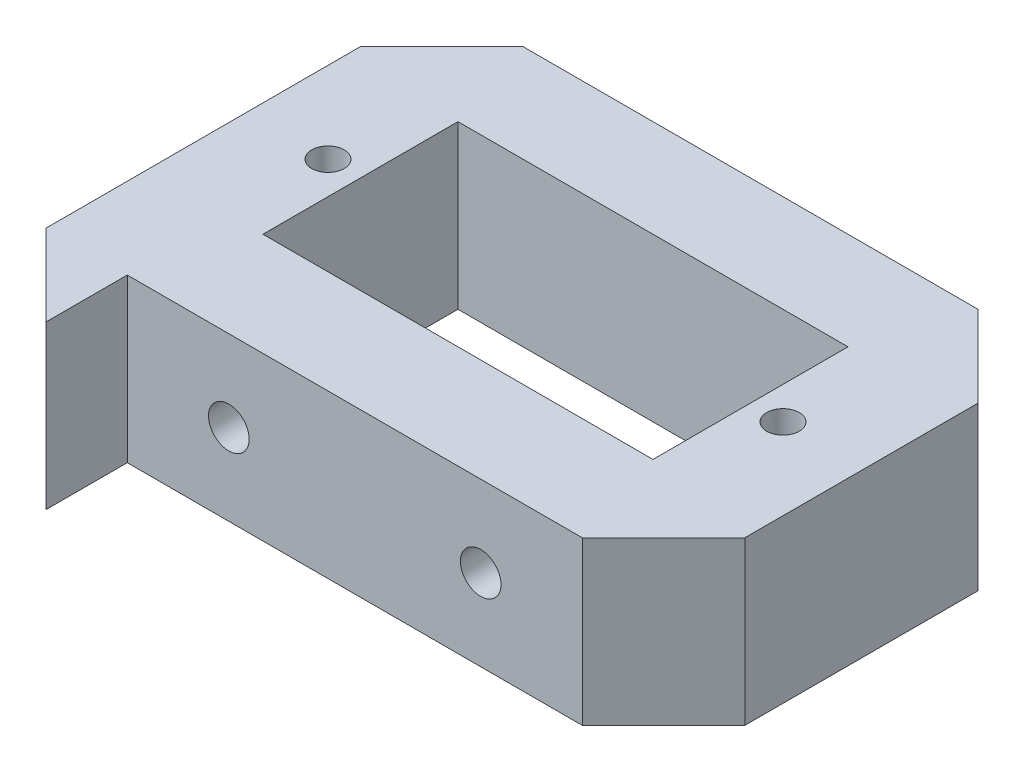
ISO-10303-21;
HEADER;
FILE_DESCRIPTION(('STEP AP214'),'2;1');
FILE_NAME('part.step','',(''),(''),'','','');
FILE_SCHEMA(('AUTOMOTIVE_DESIGN { 1 0 10303 214 1 1 1 1 }'));
ENDSEC;
DATA;
#1=APPLICATION_CONTEXT('core data for automotive mechanical design processes');
#2=APPLICATION_PROTOCOL_DEFINITION('international standard','automotive_design',2000,#1);
#3=PRODUCT_CONTEXT('',#1,'mechanical');
#4=PRODUCT('Part','Part','',(#3));
#5=PRODUCT_RELATED_PRODUCT_CATEGORY('part','',(#4));
#6=PRODUCT_DEFINITION_FORMATION('','',#4);
#7=PRODUCT_DEFINITION_CONTEXT('part definition',#1,'design');
#8=PRODUCT_DEFINITION('design','',#6,#7);
#9=PRODUCT_DEFINITION_SHAPE('','',#8);
#10=(LENGTH_UNIT() NAMED_UNIT(*) SI_UNIT(.MILLI.,.METRE.));
#11=(NAMED_UNIT(*) PLANE_ANGLE_UNIT() SI_UNIT($,.RADIAN.));
#12=(NAMED_UNIT(*) SI_UNIT($,.STERADIAN.) SOLID_ANGLE_UNIT());
#13=UNCERTAINTY_MEASURE_WITH_UNIT(LENGTH_MEASURE(1.E-05),#10,'distance_accuracy_value','');
#14=(GEOMETRIC_REPRESENTATION_CONTEXT(3) GLOBAL_UNCERTAINTY_ASSIGNED_CONTEXT((#13)) GLOBAL_UNIT_ASSIGNED_CONTEXT((#10,
#11,#12)) REPRESENTATION_CONTEXT('',''));
#15=CARTESIAN_POINT('',(0.,0.,0.));
#16=DIRECTION('',(0.,0.,1.));
#17=DIRECTION('',(1.,0.,0.));
#18=AXIS2_PLACEMENT_3D('',#15,#16,#17);
#19=CARTESIAN_POINT('',(12.0377358490566,10.,0.));
#20=DIRECTION('',(-1.,0.,0.));
#21=DIRECTION('',(0.,0.,1.));
#22=AXIS2_PLACEMENT_3D('',#19,#20,#21);
#23=PLANE('',#22);
#24=DIRECTION('',(0.,0.,-1.));
#25=VECTOR('',#24,1.);
#26=CARTESIAN_POINT('',(12.0377358490566,0.,0.));
#27=LINE('',#26,#25);
#28=CARTESIAN_POINT('',(12.0377358490566,0.,1.20754716981131));
#29=VERTEX_POINT('',#28);
#30=CARTESIAN_POINT('',(12.0377358490566,0.,-10.7924528301887));
#31=VERTEX_POINT('',#30);
#32=EDGE_CURVE('E198',#29,#31,#27,.T.);
#33=ORIENTED_EDGE('',*,*,#32,.F.);
#34=DIRECTION('',(0.,-1.,0.));
#35=VECTOR('',#34,1.);
#36=CARTESIAN_POINT('',(12.0377358490566,10.,1.20754716981131));
#37=LINE('',#36,#35);
#38=CARTESIAN_POINT('',(12.0377358490566,10.,1.20754716981131));
#39=VERTEX_POINT('',#38);
#40=EDGE_CURVE('E179',#39,#29,#37,.T.);
#41=ORIENTED_EDGE('',*,*,#40,.F.);
#42=DIRECTION('',(0.,0.,-1.));
#43=VECTOR('',#42,1.);
#44=CARTESIAN_POINT('',(12.0377358490566,10.,0.));
#45=LINE('',#44,#43);
#46=CARTESIAN_POINT('',(12.0377358490566,10.,-10.7924528301887));
#47=VERTEX_POINT('',#46);
#48=EDGE_CURVE('E223',#39,#47,#45,.T.);
#49=ORIENTED_EDGE('',*,*,#48,.T.);
#50=DIRECTION('',(0.,-1.,0.));
#51=VECTOR('',#50,1.);
#52=CARTESIAN_POINT('',(12.0377358490566,10.,-10.7924528301887));
#53=LINE('',#52,#51);
#54=EDGE_CURVE('E185',#47,#31,#53,.T.);
#55=ORIENTED_EDGE('',*,*,#54,.T.);
#56=EDGE_LOOP('',(#33,#41,#49,#55));
#57=FACE_BOUND('',#56,.T.);
#58=ADVANCED_FACE('F37',(#57),#23,.T.);
#59=CARTESIAN_POINT('',(0.,10.,1.20754716981131));
#60=DIRECTION('',(0.,0.,1.));
#61=DIRECTION('',(1.,0.,0.));
#62=AXIS2_PLACEMENT_3D('',#59,#60,#61);
#63=PLANE('',#62);
#64=CARTESIAN_POINT('',(7.78773584905659,5.,1.20754716981131));
#65=DIRECTION('',(0.,0.,1.));
#66=DIRECTION('',(1.,0.,0.));
#67=AXIS2_PLACEMENT_3D('',#64,#65,#66);
#68=CIRCLE('',#67,1.25);
#69=CARTESIAN_POINT('',(9.03773584905659,5.,1.20754716981131));
#70=VERTEX_POINT('',#69);
#71=EDGE_CURVE('E247',#70,#70,#68,.T.);
#72=ORIENTED_EDGE('',*,*,#71,.T.);
#73=EDGE_LOOP('',(#72));
#74=FACE_BOUND('',#73,.T.);
#75=CARTESIAN_POINT('',(-7.71226415094339,5.,1.20754716981131));
#76=DIRECTION('',(0.,0.,1.));
#77=DIRECTION('',(1.,0.,0.));
#78=AXIS2_PLACEMENT_3D('',#75,#76,#77);
#79=CIRCLE('',#78,1.25);
#80=CARTESIAN_POINT('',(-6.46226415094339,5.,1.20754716981131));
#81=VERTEX_POINT('',#80);
#82=EDGE_CURVE('E216',#81,#81,#79,.T.);
#83=ORIENTED_EDGE('',*,*,#82,.T.);
#84=EDGE_LOOP('',(#83));
#85=FACE_BOUND('',#84,.T.);
#86=DIRECTION('',(-1.,0.,0.));
#87=VECTOR('',#86,1.);
#88=CARTESIAN_POINT('',(0.,0.,1.20754716981131));
#89=LINE('',#88,#87);
#90=CARTESIAN_POINT('',(-11.9622641509434,0.,1.20754716981131));
#91=VERTEX_POINT('',#90);
#92=EDGE_CURVE('E195',#29,#91,#89,.T.);
#93=ORIENTED_EDGE('',*,*,#92,.T.);
#94=DIRECTION('',(0.,-1.,0.));
#95=VECTOR('',#94,1.);
#96=CARTESIAN_POINT('',(-11.9622641509434,10.,1.20754716981131));
#97=LINE('',#96,#95);
#98=CARTESIAN_POINT('',(-11.9622641509434,10.,1.20754716981131));
#99=VERTEX_POINT('',#98);
#100=EDGE_CURVE('E181',#99,#91,#97,.T.);
#101=ORIENTED_EDGE('',*,*,#100,.F.);
#102=DIRECTION('',(-1.,0.,0.));
#103=VECTOR('',#102,1.);
#104=CARTESIAN_POINT('',(0.,10.,1.20754716981131));
#105=LINE('',#104,#103);
#106=EDGE_CURVE('E221',#39,#99,#105,.T.);
#107=ORIENTED_EDGE('',*,*,#106,.F.);
#108=ORIENTED_EDGE('',*,*,#40,.T.);
#109=EDGE_LOOP('',(#93,#101,#107,#108));
#110=FACE_BOUND('',#109,.T.);
#111=ADVANCED_FACE('F294',(#74,#85,#110),#63,.F.);
#112=CARTESIAN_POINT('',(-11.9622641509434,10.,0.));
#113=DIRECTION('',(1.,0.,0.));
#114=DIRECTION('',(0.,0.,-1.));
#115=AXIS2_PLACEMENT_3D('',#112,#113,#114);
#116=PLANE('',#115);
#117=DIRECTION('',(0.,0.,1.));
#118=VECTOR('',#117,1.);
#119=CARTESIAN_POINT('',(-11.9622641509434,0.,0.));
#120=LINE('',#119,#118);
#121=CARTESIAN_POINT('',(-11.9622641509434,0.,-10.7924528301887));
#122=VERTEX_POINT('',#121);
#123=EDGE_CURVE('E192',#122,#91,#120,.T.);
#124=ORIENTED_EDGE('',*,*,#123,.F.);
#125=DIRECTION('',(0.,-1.,0.));
#126=VECTOR('',#125,1.);
#127=CARTESIAN_POINT('',(-11.9622641509434,10.,-10.7924528301887));
#128=LINE('',#127,#126);
#129=CARTESIAN_POINT('',(-11.9622641509434,10.,-10.7924528301887));
#130=VERTEX_POINT('',#129);
#131=EDGE_CURVE('E183',#130,#122,#128,.T.);
#132=ORIENTED_EDGE('',*,*,#131,.F.);
#133=DIRECTION('',(0.,0.,1.));
#134=VECTOR('',#133,1.);
#135=CARTESIAN_POINT('',(-11.9622641509434,10.,0.));
#136=LINE('',#135,#134);
#137=EDGE_CURVE('E218',#130,#99,#136,.T.);
#138=ORIENTED_EDGE('',*,*,#137,.T.);
#139=ORIENTED_EDGE('',*,*,#100,.T.);
#140=EDGE_LOOP('',(#124,#132,#138,#139));
#141=FACE_BOUND('',#140,.T.);
#142=ADVANCED_FACE('F300',(#141),#116,.T.);
#143=CARTESIAN_POINT('',(19.0377358490566,10.,0.));
#144=DIRECTION('',(1.,0.,0.));
#145=DIRECTION('',(0.,0.,-1.));
#146=AXIS2_PLACEMENT_3D('',#143,#144,#145);
#147=PLANE('',#146);
#148=DIRECTION('',(0.,0.,1.));
#149=VECTOR('',#148,1.);
#150=CARTESIAN_POINT('',(19.0377358490566,0.,0.));
#151=LINE('',#150,#149);
#152=CARTESIAN_POINT('',(19.0377358490566,0.,-11.7924528301887));
#153=VERTEX_POINT('',#152);
#154=CARTESIAN_POINT('',(19.0377358490566,0.,2.55754716981131));
#155=VERTEX_POINT('',#154);
#156=EDGE_CURVE('E207',#153,#155,#151,.T.);
#157=ORIENTED_EDGE('',*,*,#156,.F.);
#158=DIRECTION('',(0.,1.,0.));
#159=VECTOR('',#158,1.);
#160=CARTESIAN_POINT('',(19.0377358490566,10.,-11.7924528301887));
#161=LINE('',#160,#159);
#162=CARTESIAN_POINT('',(19.0377358490566,10.,-11.7924528301887));
#163=VERTEX_POINT('',#162);
#164=EDGE_CURVE('E147',#153,#163,#161,.T.);
#165=ORIENTED_EDGE('',*,*,#164,.T.);
#166=DIRECTION('',(0.,0.,1.));
#167=VECTOR('',#166,1.);
#168=CARTESIAN_POINT('',(19.0377358490566,10.,0.));
#169=LINE('',#168,#167);
#170=CARTESIAN_POINT('',(19.0377358490566,10.,2.55754716981131));
#171=VERTEX_POINT('',#170);
#172=EDGE_CURVE('E234',#163,#171,#169,.T.);
#173=ORIENTED_EDGE('',*,*,#172,.T.);
#174=DIRECTION('',(0.,-1.,0.));
#175=VECTOR('',#174,1.);
#176=CARTESIAN_POINT('',(19.0377358490566,0.,2.55754716981131));
#177=LINE('',#176,#175);
#178=EDGE_CURVE('E149',#171,#155,#177,.T.);
#179=ORIENTED_EDGE('',*,*,#178,.T.);
#180=EDGE_LOOP('',(#157,#165,#173,#179));
#181=FACE_BOUND('',#180,.T.);
#182=ADVANCED_FACE('F267',(#181),#147,.T.);
#183=CARTESIAN_POINT('',(0.,10.,-16.7924528301887));
#184=DIRECTION('',(0.,0.,-1.));
#185=DIRECTION('',(-1.,0.,0.));
#186=AXIS2_PLACEMENT_3D('',#183,#184,#185);
#187=PLANE('',#186);
#188=DIRECTION('',(1.,0.,0.));
#189=VECTOR('',#188,1.);
#190=CARTESIAN_POINT('',(0.,0.,-16.7924528301887));
#191=LINE('',#190,#189);
#192=CARTESIAN_POINT('',(-13.9622641509434,0.,-16.7924528301887));
#193=VERTEX_POINT('',#192);
#194=CARTESIAN_POINT('',(14.0377358490566,0.,-16.7924528301887));
#195=VERTEX_POINT('',#194);
#196=EDGE_CURVE('E204',#193,#195,#191,.T.);
#197=ORIENTED_EDGE('',*,*,#196,.F.);
#198=DIRECTION('',(0.,1.,0.));
#199=VECTOR('',#198,1.);
#200=CARTESIAN_POINT('',(-13.9622641509434,10.,-16.7924528301887));
#201=LINE('',#200,#199);
#202=CARTESIAN_POINT('',(-13.9622641509434,10.,-16.7924528301887));
#203=VERTEX_POINT('',#202);
#204=EDGE_CURVE('E165',#193,#203,#201,.T.);
#205=ORIENTED_EDGE('',*,*,#204,.T.);
#206=DIRECTION('',(1.,0.,0.));
#207=VECTOR('',#206,1.);
#208=CARTESIAN_POINT('',(0.,10.,-16.7924528301887));
#209=LINE('',#208,#207);
#210=CARTESIAN_POINT('',(14.0377358490566,10.,-16.7924528301887));
#211=VERTEX_POINT('',#210);
#212=EDGE_CURVE('E231',#203,#211,#209,.T.);
#213=ORIENTED_EDGE('',*,*,#212,.T.);
#214=DIRECTION('',(0.,-1.,0.));
#215=VECTOR('',#214,1.);
#216=CARTESIAN_POINT('',(14.0377358490566,10.,-16.7924528301887));
#217=LINE('',#216,#215);
#218=EDGE_CURVE('E167',#211,#195,#217,.T.);
#219=ORIENTED_EDGE('',*,*,#218,.T.);
#220=EDGE_LOOP('',(#197,#205,#213,#219));
#221=FACE_BOUND('',#220,.T.);
#222=ADVANCED_FACE('F276',(#221),#187,.T.);
#223=CARTESIAN_POINT('',(-18.9622641509434,10.,0.));
#224=DIRECTION('',(-1.,0.,0.));
#225=DIRECTION('',(0.,0.,1.));
#226=AXIS2_PLACEMENT_3D('',#223,#224,#225);
#227=PLANE('',#226);
#228=DIRECTION('',(0.,0.,-1.));
#229=VECTOR('',#228,1.);
#230=CARTESIAN_POINT('',(-18.9622641509434,0.,0.));
#231=LINE('',#230,#229);
#232=CARTESIAN_POINT('',(-18.9622641509434,0.,7.55754716981132));
#233=VERTEX_POINT('',#232);
#234=CARTESIAN_POINT('',(-18.9622641509434,0.,-11.7924528301887));
#235=VERTEX_POINT('',#234);
#236=EDGE_CURVE('E202',#233,#235,#231,.T.);
#237=ORIENTED_EDGE('',*,*,#236,.F.);
#238=DIRECTION('',(0.,1.,0.));
#239=VECTOR('',#238,1.);
#240=CARTESIAN_POINT('',(-18.9622641509434,10.,7.55754716981132));
#241=LINE('',#240,#239);
#242=CARTESIAN_POINT('',(-18.9622641509434,10.,7.55754716981131));
#243=VERTEX_POINT('',#242);
#244=EDGE_CURVE('E144',#233,#243,#241,.T.);
#245=ORIENTED_EDGE('',*,*,#244,.T.);
#246=DIRECTION('',(0.,0.,-1.));
#247=VECTOR('',#246,1.);
#248=CARTESIAN_POINT('',(-18.9622641509434,10.,0.));
#249=LINE('',#248,#247);
#250=CARTESIAN_POINT('',(-18.9622641509434,10.,-11.7924528301887));
#251=VERTEX_POINT('',#250);
#252=EDGE_CURVE('E229',#243,#251,#249,.T.);
#253=ORIENTED_EDGE('',*,*,#252,.T.);
#254=DIRECTION('',(0.,-1.,0.));
#255=VECTOR('',#254,1.);
#256=CARTESIAN_POINT('',(-18.9622641509434,10.,-11.7924528301887));
#257=LINE('',#256,#255);
#258=EDGE_CURVE('E176',#251,#235,#257,.T.);
#259=ORIENTED_EDGE('',*,*,#258,.T.);
#260=EDGE_LOOP('',(#237,#245,#253,#259));
#261=FACE_BOUND('',#260,.T.);
#262=ADVANCED_FACE('F282',(#261),#227,.T.);
#263=CARTESIAN_POINT('',(0.,10.,7.55754716981131));
#264=DIRECTION('',(0.,0.,-1.));
#265=DIRECTION('',(-1.,0.,0.));
#266=AXIS2_PLACEMENT_3D('',#263,#264,#265);
#267=PLANE('',#266);
#268=CARTESIAN_POINT('',(7.78773584905659,5.,7.55754716981131));
#269=DIRECTION('',(0.,0.,1.));
#270=DIRECTION('',(1.,0.,0.));
#271=AXIS2_PLACEMENT_3D('',#268,#269,#270);
#272=CIRCLE('',#271,1.25);
#273=CARTESIAN_POINT('',(9.03773584905659,5.,7.55754716981131));
#274=VERTEX_POINT('',#273);
#275=EDGE_CURVE('E142',#274,#274,#272,.T.);
#276=ORIENTED_EDGE('',*,*,#275,.F.);
#277=EDGE_LOOP('',(#276));
#278=FACE_BOUND('',#277,.T.);
#279=CARTESIAN_POINT('',(-7.71226415094339,5.,7.55754716981131));
#280=DIRECTION('',(0.,0.,1.));
#281=DIRECTION('',(1.,0.,0.));
#282=AXIS2_PLACEMENT_3D('',#279,#280,#281);
#283=CIRCLE('',#282,1.25);
#284=CARTESIAN_POINT('',(-6.46226415094339,5.,7.55754716981131));
#285=VERTEX_POINT('',#284);
#286=EDGE_CURVE('E244',#285,#285,#283,.T.);
#287=ORIENTED_EDGE('',*,*,#286,.F.);
#288=EDGE_LOOP('',(#287));
#289=FACE_BOUND('',#288,.T.);
#290=DIRECTION('',(1.,0.,0.));
#291=VECTOR('',#290,1.);
#292=CARTESIAN_POINT('',(0.,10.,7.55754716981131));
#293=LINE('',#292,#291);
#294=CARTESIAN_POINT('',(-13.9622641509434,10.,7.55754716981131));
#295=VERTEX_POINT('',#294);
#296=CARTESIAN_POINT('',(14.0377358490566,10.,7.55754716981131));
#297=VERTEX_POINT('',#296);
#298=EDGE_CURVE('E226',#295,#297,#293,.T.);
#299=ORIENTED_EDGE('',*,*,#298,.F.);
#300=DIRECTION('',(0.,-1.,0.));
#301=VECTOR('',#300,1.);
#302=CARTESIAN_POINT('',(-13.9622641509434,0.,7.55754716981131));
#303=LINE('',#302,#301);
#304=CARTESIAN_POINT('',(-13.9622641509434,0.,7.55754716981131));
#305=VERTEX_POINT('',#304);
#306=EDGE_CURVE('E154',#295,#305,#303,.T.);
#307=ORIENTED_EDGE('',*,*,#306,.T.);
#308=DIRECTION('',(1.,0.,0.));
#309=VECTOR('',#308,1.);
#310=CARTESIAN_POINT('',(0.,0.,7.55754716981131));
#311=LINE('',#310,#309);
#312=CARTESIAN_POINT('',(14.0377358490566,0.,7.55754716981131));
#313=VERTEX_POINT('',#312);
#314=EDGE_CURVE('E133',#305,#313,#311,.T.);
#315=ORIENTED_EDGE('',*,*,#314,.T.);
#316=DIRECTION('',(0.,1.,0.));
#317=VECTOR('',#316,1.);
#318=CARTESIAN_POINT('',(14.0377358490566,10.,7.55754716981131));
#319=LINE('',#318,#317);
#320=EDGE_CURVE('E156',#313,#297,#319,.T.);
#321=ORIENTED_EDGE('',*,*,#320,.T.);
#322=EDGE_LOOP('',(#299,#307,#315,#321));
#323=FACE_BOUND('',#322,.T.);
#324=ADVANCED_FACE('F258',(#278,#289,#323),#267,.F.);
#325=CARTESIAN_POINT('',(-13.9622641509434,10.,-4.79245283018869));
#326=DIRECTION('',(0.,-1.,0.));
#327=DIRECTION('',(0.,0.,-1.));
#328=AXIS2_PLACEMENT_3D('',#325,#326,#327);
#329=CYLINDRICAL_SURFACE('',#328,1.);
#330=CARTESIAN_POINT('',(-13.9622641509434,10.,-4.79245283018869));
#331=DIRECTION('',(0.,1.,0.));
#332=DIRECTION('',(0.,0.,1.));
#333=AXIS2_PLACEMENT_3D('',#330,#331,#332);
#334=CIRCLE('',#333,1.);
#335=CARTESIAN_POINT('',(-13.9622641509434,10.,-3.79245283018869));
#336=VERTEX_POINT('',#335);
#337=EDGE_CURVE('E237',#336,#336,#334,.T.);
#338=ORIENTED_EDGE('',*,*,#337,.T.);
#339=EDGE_LOOP('',(#338));
#340=FACE_BOUND('',#339,.T.);
#341=CARTESIAN_POINT('',(-13.9622641509434,0.,-4.79245283018869));
#342=DIRECTION('',(0.,1.,0.));
#343=DIRECTION('',(0.,0.,1.));
#344=AXIS2_PLACEMENT_3D('',#341,#342,#343);
#345=CIRCLE('',#344,1.);
#346=CARTESIAN_POINT('',(-13.9622641509434,0.,-3.79245283018869));
#347=VERTEX_POINT('',#346);
#348=EDGE_CURVE('E210',#347,#347,#345,.T.);
#349=ORIENTED_EDGE('',*,*,#348,.F.);
#350=EDGE_LOOP('',(#349));
#351=FACE_BOUND('',#350,.T.);
#352=ADVANCED_FACE('F289',(#340,#351),#329,.F.);
#353=CARTESIAN_POINT('',(14.0377358490566,10.,-4.79245283018869));
#354=DIRECTION('',(0.,-1.,0.));
#355=DIRECTION('',(0.,0.,-1.));
#356=AXIS2_PLACEMENT_3D('',#353,#354,#355);
#357=CYLINDRICAL_SURFACE('',#356,1.);
#358=CARTESIAN_POINT('',(14.0377358490566,10.,-4.79245283018869));
#359=DIRECTION('',(0.,1.,0.));
#360=DIRECTION('',(0.,0.,1.));
#361=AXIS2_PLACEMENT_3D('',#358,#359,#360);
#362=CIRCLE('',#361,1.);
#363=CARTESIAN_POINT('',(14.0377358490566,10.,-3.79245283018869));
#364=VERTEX_POINT('',#363);
#365=EDGE_CURVE('E191',#364,#364,#362,.T.);
#366=ORIENTED_EDGE('',*,*,#365,.T.);
#367=EDGE_LOOP('',(#366));
#368=FACE_BOUND('',#367,.T.);
#369=CARTESIAN_POINT('',(14.0377358490566,0.,-4.79245283018869));
#370=DIRECTION('',(0.,1.,0.));
#371=DIRECTION('',(0.,0.,1.));
#372=AXIS2_PLACEMENT_3D('',#369,#370,#371);
#373=CIRCLE('',#372,1.);
#374=CARTESIAN_POINT('',(14.0377358490566,0.,-3.79245283018869));
#375=VERTEX_POINT('',#374);
#376=EDGE_CURVE('E213',#375,#375,#373,.T.);
#377=ORIENTED_EDGE('',*,*,#376,.F.);
#378=EDGE_LOOP('',(#377));
#379=FACE_BOUND('',#378,.T.);
#380=ADVANCED_FACE('F311',(#368,#379),#357,.F.);
#381=CARTESIAN_POINT('',(0.,10.,-10.7924528301887));
#382=DIRECTION('',(0.,0.,-1.));
#383=DIRECTION('',(-1.,0.,0.));
#384=AXIS2_PLACEMENT_3D('',#381,#382,#383);
#385=PLANE('',#384);
#386=DIRECTION('',(1.,0.,0.));
#387=VECTOR('',#386,1.);
#388=CARTESIAN_POINT('',(0.,0.,-10.7924528301887));
#389=LINE('',#388,#387);
#390=EDGE_CURVE('E188',#122,#31,#389,.T.);
#391=ORIENTED_EDGE('',*,*,#390,.T.);
#392=ORIENTED_EDGE('',*,*,#54,.F.);
#393=DIRECTION('',(1.,0.,0.));
#394=VECTOR('',#393,1.);
#395=CARTESIAN_POINT('',(0.,10.,-10.7924528301887));
#396=LINE('',#395,#394);
#397=EDGE_CURVE('E187',#130,#47,#396,.T.);
#398=ORIENTED_EDGE('',*,*,#397,.F.);
#399=ORIENTED_EDGE('',*,*,#131,.T.);
#400=EDGE_LOOP('',(#391,#392,#398,#399));
#401=FACE_BOUND('',#400,.T.);
#402=ADVANCED_FACE('F308',(#401),#385,.F.);
#403=CARTESIAN_POINT('',(0.,10.,0.));
#404=DIRECTION('',(0.,1.,0.));
#405=DIRECTION('',(0.,0.,1.));
#406=AXIS2_PLACEMENT_3D('',#403,#404,#405);
#407=PLANE('',#406);
#408=ORIENTED_EDGE('',*,*,#252,.F.);
#409=DIRECTION('',(-0.707106781186549,0.,-0.707106781186546));
#410=VECTOR('',#409,1.);
#411=CARTESIAN_POINT('',(-13.2599056603773,10.,13.2599056603774));
#412=LINE('',#411,#410);
#413=CARTESIAN_POINT('',(-13.9622641509434,10.,12.5575471698113));
#414=VERTEX_POINT('',#413);
#415=EDGE_CURVE('E45',#243,#414,#412,.F.);
#416=ORIENTED_EDGE('',*,*,#415,.T.);
#417=DIRECTION('',(0.,0.,-1.));
#418=VECTOR('',#417,1.);
#419=CARTESIAN_POINT('',(-13.9622641509434,10.,7.55754716981131));
#420=LINE('',#419,#418);
#421=EDGE_CURVE('E138',#414,#295,#420,.T.);
#422=ORIENTED_EDGE('',*,*,#421,.T.);
#423=ORIENTED_EDGE('',*,*,#298,.T.);
#424=DIRECTION('',(0.707106781186549,0.,-0.707106781186547));
#425=VECTOR('',#424,1.);
#426=CARTESIAN_POINT('',(10.7976415094339,10.,10.797641509434));
#427=LINE('',#426,#425);
#428=EDGE_CURVE('E163',#297,#171,#427,.T.);
#429=ORIENTED_EDGE('',*,*,#428,.T.);
#430=ORIENTED_EDGE('',*,*,#172,.F.);
#431=DIRECTION('',(0.707106781186547,0.,0.707106781186549));
#432=VECTOR('',#431,1.);
#433=CARTESIAN_POINT('',(15.4150943396227,10.,-15.4150943396226));
#434=LINE('',#433,#432);
#435=EDGE_CURVE('E161',#163,#211,#434,.F.);
#436=ORIENTED_EDGE('',*,*,#435,.T.);
#437=ORIENTED_EDGE('',*,*,#212,.F.);
#438=DIRECTION('',(0.707106781186549,0.,-0.707106781186547));
#439=VECTOR('',#438,1.);
#440=CARTESIAN_POINT('',(-15.377358490566,10.,-15.3773584905661));
#441=LINE('',#440,#439);
#442=EDGE_CURVE('E158',#203,#251,#441,.F.);
#443=ORIENTED_EDGE('',*,*,#442,.T.);
#444=EDGE_LOOP('',(#408,#416,#422,#423,#429,#430,#436,#437,#443));
#445=FACE_BOUND('',#444,.T.);
#446=ORIENTED_EDGE('',*,*,#365,.F.);
#447=EDGE_LOOP('',(#446));
#448=FACE_BOUND('',#447,.T.);
#449=ORIENTED_EDGE('',*,*,#337,.F.);
#450=EDGE_LOOP('',(#449));
#451=FACE_BOUND('',#450,.T.);
#452=ORIENTED_EDGE('',*,*,#48,.F.);
#453=ORIENTED_EDGE('',*,*,#106,.T.);
#454=ORIENTED_EDGE('',*,*,#137,.F.);
#455=ORIENTED_EDGE('',*,*,#397,.T.);
#456=EDGE_LOOP('',(#452,#453,#454,#455));
#457=FACE_BOUND('',#456,.T.);
#458=ADVANCED_FACE('F253',(#445,#448,#451,#457),#407,.T.);
#459=CARTESIAN_POINT('',(0.,0.,0.));
#460=DIRECTION('',(0.,1.,0.));
#461=DIRECTION('',(0.,0.,1.));
#462=AXIS2_PLACEMENT_3D('',#459,#460,#461);
#463=PLANE('',#462);
#464=ORIENTED_EDGE('',*,*,#376,.T.);
#465=EDGE_LOOP('',(#464));
#466=FACE_BOUND('',#465,.T.);
#467=ORIENTED_EDGE('',*,*,#348,.T.);
#468=EDGE_LOOP('',(#467));
#469=FACE_BOUND('',#468,.T.);
#470=DIRECTION('',(0.,0.,-1.));
#471=VECTOR('',#470,1.);
#472=CARTESIAN_POINT('',(-13.9622641509434,0.,7.55754716981131));
#473=LINE('',#472,#471);
#474=CARTESIAN_POINT('',(-13.9622641509434,0.,12.5575471698113));
#475=VERTEX_POINT('',#474);
#476=EDGE_CURVE('E128',#475,#305,#473,.T.);
#477=ORIENTED_EDGE('',*,*,#476,.F.);
#478=DIRECTION('',(0.707106781186549,0.,0.707106781186546));
#479=VECTOR('',#478,1.);
#480=CARTESIAN_POINT('',(-18.9622641509434,0.,7.55754716981132));
#481=LINE('',#480,#479);
#482=EDGE_CURVE('E11',#475,#233,#481,.F.);
#483=ORIENTED_EDGE('',*,*,#482,.T.);
#484=ORIENTED_EDGE('',*,*,#236,.T.);
#485=DIRECTION('',(-0.707106781186549,0.,0.707106781186547));
#486=VECTOR('',#485,1.);
#487=CARTESIAN_POINT('',(-18.9622641509434,0.,-11.7924528301887));
#488=LINE('',#487,#486);
#489=EDGE_CURVE('E170',#235,#193,#488,.F.);
#490=ORIENTED_EDGE('',*,*,#489,.T.);
#491=ORIENTED_EDGE('',*,*,#196,.T.);
#492=DIRECTION('',(-0.707106781186547,0.,-0.707106781186549));
#493=VECTOR('',#492,1.);
#494=CARTESIAN_POINT('',(14.0377358490566,0.,-16.7924528301887));
#495=LINE('',#494,#493);
#496=EDGE_CURVE('E172',#195,#153,#495,.F.);
#497=ORIENTED_EDGE('',*,*,#496,.T.);
#498=ORIENTED_EDGE('',*,*,#156,.T.);
#499=DIRECTION('',(-0.707106781186549,0.,0.707106781186547));
#500=VECTOR('',#499,1.);
#501=CARTESIAN_POINT('',(19.0377358490566,0.,2.55754716981131));
#502=LINE('',#501,#500);
#503=EDGE_CURVE('E174',#155,#313,#502,.T.);
#504=ORIENTED_EDGE('',*,*,#503,.T.);
#505=ORIENTED_EDGE('',*,*,#314,.F.);
#506=EDGE_LOOP('',(#477,#483,#484,#490,#491,#497,#498,#504,#505));
#507=FACE_BOUND('',#506,.T.);
#508=ORIENTED_EDGE('',*,*,#32,.T.);
#509=ORIENTED_EDGE('',*,*,#390,.F.);
#510=ORIENTED_EDGE('',*,*,#123,.T.);
#511=ORIENTED_EDGE('',*,*,#92,.F.);
#512=EDGE_LOOP('',(#508,#509,#510,#511));
#513=FACE_BOUND('',#512,.T.);
#514=ADVANCED_FACE('F130',(#466,#469,#507,#513),#463,.F.);
#515=CARTESIAN_POINT('',(-18.9622641509434,10.,-11.7924528301887));
#516=DIRECTION('',(0.707106781186546,0.,0.707106781186548));
#517=DIRECTION('',(0.,-1.,0.));
#518=AXIS2_PLACEMENT_3D('',#515,#516,#517);
#519=PLANE('',#518);
#520=ORIENTED_EDGE('',*,*,#442,.F.);
#521=ORIENTED_EDGE('',*,*,#204,.F.);
#522=ORIENTED_EDGE('',*,*,#489,.F.);
#523=ORIENTED_EDGE('',*,*,#258,.F.);
#524=EDGE_LOOP('',(#520,#521,#522,#523));
#525=FACE_BOUND('',#524,.T.);
#526=ADVANCED_FACE('F280',(#525),#519,.F.);
#527=CARTESIAN_POINT('',(14.0377358490566,10.,-16.7924528301887));
#528=DIRECTION('',(-0.707106781186549,0.,0.707106781186547));
#529=DIRECTION('',(0.,-1.,0.));
#530=AXIS2_PLACEMENT_3D('',#527,#528,#529);
#531=PLANE('',#530);
#532=ORIENTED_EDGE('',*,*,#435,.F.);
#533=ORIENTED_EDGE('',*,*,#164,.F.);
#534=ORIENTED_EDGE('',*,*,#496,.F.);
#535=ORIENTED_EDGE('',*,*,#218,.F.);
#536=EDGE_LOOP('',(#532,#533,#534,#535));
#537=FACE_BOUND('',#536,.T.);
#538=ADVANCED_FACE('F270',(#537),#531,.F.);
#539=CARTESIAN_POINT('',(19.0377358490566,10.,2.55754716981131));
#540=DIRECTION('',(0.707106781186547,0.,0.707106781186549));
#541=DIRECTION('',(0.,1.,0.));
#542=AXIS2_PLACEMENT_3D('',#539,#540,#541);
#543=PLANE('',#542);
#544=ORIENTED_EDGE('',*,*,#428,.F.);
#545=ORIENTED_EDGE('',*,*,#320,.F.);
#546=ORIENTED_EDGE('',*,*,#503,.F.);
#547=ORIENTED_EDGE('',*,*,#178,.F.);
#548=EDGE_LOOP('',(#544,#545,#546,#547));
#549=FACE_BOUND('',#548,.T.);
#550=ADVANCED_FACE('F261',(#549),#543,.T.);
#551=CARTESIAN_POINT('',(-7.71226415094339,5.,-4.44245283018869));
#552=DIRECTION('',(0.,0.,1.));
#553=DIRECTION('',(1.,0.,0.));
#554=AXIS2_PLACEMENT_3D('',#551,#552,#553);
#555=CYLINDRICAL_SURFACE('',#554,1.25);
#556=ORIENTED_EDGE('',*,*,#286,.T.);
#557=EDGE_LOOP('',(#556));
#558=FACE_BOUND('',#557,.T.);
#559=ORIENTED_EDGE('',*,*,#82,.F.);
#560=EDGE_LOOP('',(#559));
#561=FACE_BOUND('',#560,.T.);
#562=ADVANCED_FACE('F318',(#558,#561),#555,.F.);
#563=CARTESIAN_POINT('',(7.78773584905659,5.,-4.44245283018869));
#564=DIRECTION('',(0.,0.,1.));
#565=DIRECTION('',(1.,0.,0.));
#566=AXIS2_PLACEMENT_3D('',#563,#564,#565);
#567=CYLINDRICAL_SURFACE('',#566,1.25);
#568=ORIENTED_EDGE('',*,*,#275,.T.);
#569=EDGE_LOOP('',(#568));
#570=FACE_BOUND('',#569,.T.);
#571=ORIENTED_EDGE('',*,*,#71,.F.);
#572=EDGE_LOOP('',(#571));
#573=FACE_BOUND('',#572,.T.);
#574=ADVANCED_FACE('F321',(#570,#573),#567,.F.);
#575=CARTESIAN_POINT('',(-13.9622641509434,0.,7.55754716981131));
#576=DIRECTION('',(1.,0.,0.));
#577=DIRECTION('',(0.,0.,-1.));
#578=AXIS2_PLACEMENT_3D('',#575,#576,#577);
#579=PLANE('',#578);
#580=ORIENTED_EDGE('',*,*,#476,.T.);
#581=ORIENTED_EDGE('',*,*,#306,.F.);
#582=ORIENTED_EDGE('',*,*,#421,.F.);
#583=DIRECTION('',(0.,1.,0.));
#584=VECTOR('',#583,1.);
#585=CARTESIAN_POINT('',(-13.9622641509434,0.,12.5575471698113));
#586=LINE('',#585,#584);
#587=EDGE_CURVE('E137',#475,#414,#586,.T.);
#588=ORIENTED_EDGE('',*,*,#587,.F.);
#589=EDGE_LOOP('',(#580,#581,#582,#588));
#590=FACE_BOUND('',#589,.T.);
#591=ADVANCED_FACE('F141',(#590),#579,.T.);
#592=CARTESIAN_POINT('',(-18.9622641509434,10.,7.55754716981132));
#593=DIRECTION('',(0.707106781186546,0.,-0.707106781186549));
#594=DIRECTION('',(0.,1.,0.));
#595=AXIS2_PLACEMENT_3D('',#592,#593,#594);
#596=PLANE('',#595);
#597=ORIENTED_EDGE('',*,*,#482,.F.);
#598=ORIENTED_EDGE('',*,*,#587,.T.);
#599=ORIENTED_EDGE('',*,*,#415,.F.);
#600=ORIENTED_EDGE('',*,*,#244,.F.);
#601=EDGE_LOOP('',(#597,#598,#599,#600));
#602=FACE_BOUND('',#601,.T.);
#603=ADVANCED_FACE('F39',(#602),#596,.F.);
#604=CLOSED_SHELL('',(#58,#111,#142,#182,#222,#262,#324,#352,#380,#402,#458,#514,#526,#538,#550,
#562,#574,#591,#603));
#605=MANIFOLD_SOLID_BREP('B2',#604);
#606=ADVANCED_BREP_SHAPE_REPRESENTATION('',(#18,#605),#14);
#607=SHAPE_DEFINITION_REPRESENTATION(#9,#606);
ENDSEC;
END-ISO-10303-21;
